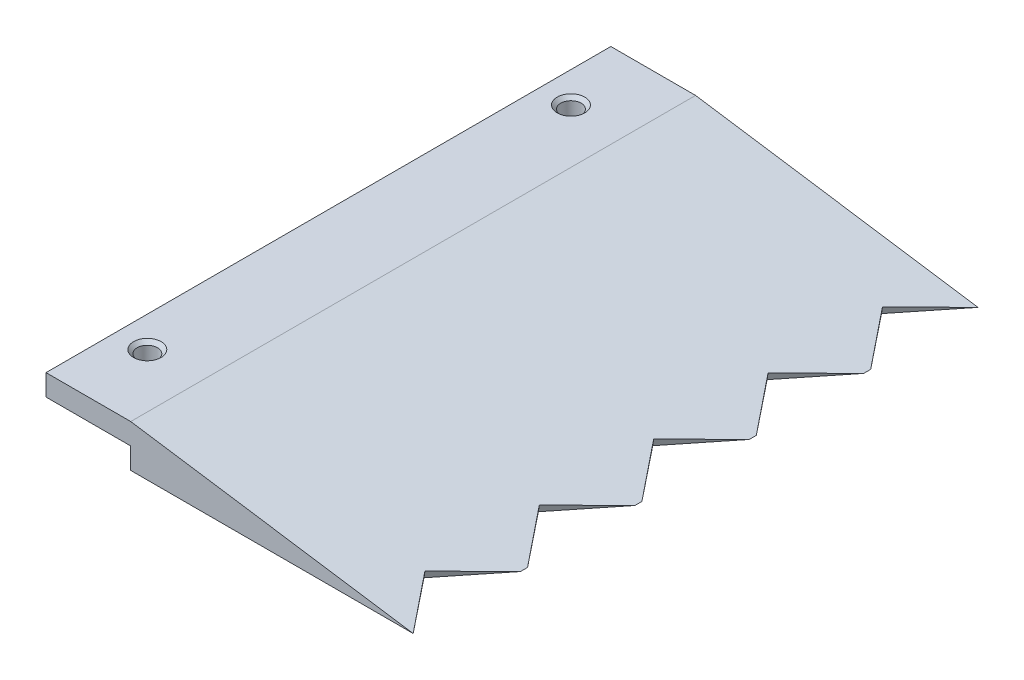
ISO-10303-21;
HEADER;
FILE_DESCRIPTION(('STEP AP214'),'2;1');
FILE_NAME('part.step','',(''),(''),'','','');
FILE_SCHEMA(('AUTOMOTIVE_DESIGN { 1 0 10303 214 1 1 1 1 }'));
ENDSEC;
DATA;
#1=APPLICATION_CONTEXT('core data for automotive mechanical design processes');
#2=APPLICATION_PROTOCOL_DEFINITION('international standard','automotive_design',2000,#1);
#3=PRODUCT_CONTEXT('',#1,'mechanical');
#4=PRODUCT('Part','Part','',(#3));
#5=PRODUCT_RELATED_PRODUCT_CATEGORY('part','',(#4));
#6=PRODUCT_DEFINITION_FORMATION('','',#4);
#7=PRODUCT_DEFINITION_CONTEXT('part definition',#1,'design');
#8=PRODUCT_DEFINITION('design','',#6,#7);
#9=PRODUCT_DEFINITION_SHAPE('','',#8);
#10=(LENGTH_UNIT() NAMED_UNIT(*) SI_UNIT(.MILLI.,.METRE.));
#11=(NAMED_UNIT(*) PLANE_ANGLE_UNIT() SI_UNIT($,.RADIAN.));
#12=(NAMED_UNIT(*) SI_UNIT($,.STERADIAN.) SOLID_ANGLE_UNIT());
#13=UNCERTAINTY_MEASURE_WITH_UNIT(LENGTH_MEASURE(1.E-05),#10,'distance_accuracy_value','');
#14=(GEOMETRIC_REPRESENTATION_CONTEXT(3) GLOBAL_UNCERTAINTY_ASSIGNED_CONTEXT((#13)) GLOBAL_UNIT_ASSIGNED_CONTEXT((#10,
#11,#12)) REPRESENTATION_CONTEXT('',''));
#15=CARTESIAN_POINT('',(0.,0.,0.));
#16=DIRECTION('',(0.,0.,1.));
#17=DIRECTION('',(1.,0.,0.));
#18=AXIS2_PLACEMENT_3D('',#15,#16,#17);
#19=CARTESIAN_POINT('',(0.,3.,40.));
#20=DIRECTION('',(1.,0.,0.));
#21=DIRECTION('',(0.,0.,-1.));
#22=AXIS2_PLACEMENT_3D('',#19,#20,#21);
#23=PLANE('',#22);
#24=DIRECTION('',(0.,-1.,0.));
#25=VECTOR('',#24,1.);
#26=CARTESIAN_POINT('',(0.,3.,-40.));
#27=LINE('',#26,#25);
#28=CARTESIAN_POINT('',(0.,6.,-40.));
#29=VERTEX_POINT('',#28);
#30=CARTESIAN_POINT('',(0.,3.,-40.));
#31=VERTEX_POINT('',#30);
#32=EDGE_CURVE('E225',#29,#31,#27,.T.);
#33=ORIENTED_EDGE('',*,*,#32,.T.);
#34=DIRECTION('',(0.,0.,-1.));
#35=VECTOR('',#34,1.);
#36=CARTESIAN_POINT('',(0.,3.,40.));
#37=LINE('',#36,#35);
#38=CARTESIAN_POINT('',(0.,3.,40.));
#39=VERTEX_POINT('',#38);
#40=EDGE_CURVE('E380',#39,#31,#37,.T.);
#41=ORIENTED_EDGE('',*,*,#40,.F.);
#42=DIRECTION('',(0.,-1.,0.));
#43=VECTOR('',#42,1.);
#44=CARTESIAN_POINT('',(0.,3.,40.));
#45=LINE('',#44,#43);
#46=CARTESIAN_POINT('',(0.,6.,40.));
#47=VERTEX_POINT('',#46);
#48=EDGE_CURVE('E211',#47,#39,#45,.T.);
#49=ORIENTED_EDGE('',*,*,#48,.F.);
#50=DIRECTION('',(0.,0.,-1.));
#51=VECTOR('',#50,1.);
#52=CARTESIAN_POINT('',(0.,6.,40.));
#53=LINE('',#52,#51);
#54=EDGE_CURVE('E198',#47,#29,#53,.T.);
#55=ORIENTED_EDGE('',*,*,#54,.T.);
#56=EDGE_LOOP('',(#33,#41,#49,#55));
#57=FACE_BOUND('',#56,.T.);
#58=ADVANCED_FACE('F39',(#57),#23,.F.);
#59=CARTESIAN_POINT('',(12.,3.,40.));
#60=DIRECTION('',(0.,1.,0.));
#61=DIRECTION('',(-1.,0.,0.));
#62=AXIS2_PLACEMENT_3D('',#59,#60,#61);
#63=PLANE('',#62);
#64=CARTESIAN_POINT('',(4.35,3.,30.));
#65=DIRECTION('',(0.,1.,0.));
#66=DIRECTION('',(-1.,0.,0.));
#67=AXIS2_PLACEMENT_3D('',#64,#65,#66);
#68=CIRCLE('',#67,1.45);
#69=CARTESIAN_POINT('',(2.9,3.,30.));
#70=VERTEX_POINT('',#69);
#71=EDGE_CURVE('E290',#70,#70,#68,.T.);
#72=ORIENTED_EDGE('',*,*,#71,.T.);
#73=EDGE_LOOP('',(#72));
#74=FACE_BOUND('',#73,.T.);
#75=CARTESIAN_POINT('',(4.34999999999979,3.,-30.));
#76=DIRECTION('',(0.,1.,0.));
#77=DIRECTION('',(-1.,0.,0.));
#78=AXIS2_PLACEMENT_3D('',#75,#76,#77);
#79=CIRCLE('',#78,1.45);
#80=CARTESIAN_POINT('',(2.89999999999979,3.,-30.));
#81=VERTEX_POINT('',#80);
#82=EDGE_CURVE('E297',#81,#81,#79,.T.);
#83=ORIENTED_EDGE('',*,*,#82,.T.);
#84=EDGE_LOOP('',(#83));
#85=FACE_BOUND('',#84,.T.);
#86=DIRECTION('',(1.,0.,0.));
#87=VECTOR('',#86,1.);
#88=CARTESIAN_POINT('',(12.,3.,-40.));
#89=LINE('',#88,#87);
#90=CARTESIAN_POINT('',(12.,3.,-40.));
#91=VERTEX_POINT('',#90);
#92=EDGE_CURVE('E222',#31,#91,#89,.T.);
#93=ORIENTED_EDGE('',*,*,#92,.T.);
#94=DIRECTION('',(0.,0.,-1.));
#95=VECTOR('',#94,1.);
#96=CARTESIAN_POINT('',(12.,3.,40.));
#97=LINE('',#96,#95);
#98=CARTESIAN_POINT('',(12.,3.,40.));
#99=VERTEX_POINT('',#98);
#100=EDGE_CURVE('E185',#99,#91,#97,.T.);
#101=ORIENTED_EDGE('',*,*,#100,.F.);
#102=DIRECTION('',(1.,0.,0.));
#103=VECTOR('',#102,1.);
#104=CARTESIAN_POINT('',(12.,3.,40.));
#105=LINE('',#104,#103);
#106=EDGE_CURVE('E242',#39,#99,#105,.T.);
#107=ORIENTED_EDGE('',*,*,#106,.F.);
#108=ORIENTED_EDGE('',*,*,#40,.T.);
#109=EDGE_LOOP('',(#93,#101,#107,#108));
#110=FACE_BOUND('',#109,.T.);
#111=ADVANCED_FACE('F302',(#74,#85,#110),#63,.F.);
#112=CARTESIAN_POINT('',(12.,0.,40.));
#113=DIRECTION('',(1.,0.,0.));
#114=DIRECTION('',(0.,1.,0.));
#115=AXIS2_PLACEMENT_3D('',#112,#113,#114);
#116=PLANE('',#115);
#117=DIRECTION('',(0.,-1.,0.));
#118=VECTOR('',#117,1.);
#119=CARTESIAN_POINT('',(12.,0.,-40.));
#120=LINE('',#119,#118);
#121=CARTESIAN_POINT('',(12.,0.,-40.));
#122=VERTEX_POINT('',#121);
#123=EDGE_CURVE('E219',#91,#122,#120,.T.);
#124=ORIENTED_EDGE('',*,*,#123,.T.);
#125=DIRECTION('',(0.,0.,-1.));
#126=VECTOR('',#125,1.);
#127=CARTESIAN_POINT('',(12.,0.,40.));
#128=LINE('',#127,#126);
#129=CARTESIAN_POINT('',(12.,0.,40.));
#130=VERTEX_POINT('',#129);
#131=EDGE_CURVE('E178',#130,#122,#128,.T.);
#132=ORIENTED_EDGE('',*,*,#131,.F.);
#133=DIRECTION('',(0.,-1.,0.));
#134=VECTOR('',#133,1.);
#135=CARTESIAN_POINT('',(12.,0.,40.));
#136=LINE('',#135,#134);
#137=EDGE_CURVE('E239',#99,#130,#136,.T.);
#138=ORIENTED_EDGE('',*,*,#137,.F.);
#139=ORIENTED_EDGE('',*,*,#100,.T.);
#140=EDGE_LOOP('',(#124,#132,#138,#139));
#141=FACE_BOUND('',#140,.T.);
#142=ADVANCED_FACE('F327',(#141),#116,.F.);
#143=CARTESIAN_POINT('',(52.,0.,40.));
#144=DIRECTION('',(0.,1.,0.));
#145=DIRECTION('',(0.,0.,1.));
#146=AXIS2_PLACEMENT_3D('',#143,#144,#145);
#147=PLANE('',#146);
#148=DIRECTION('',(-0.623887399248366,0.,0.781514243670011));
#149=VECTOR('',#148,1.);
#150=CARTESIAN_POINT('',(28.7913400855593,0.,21.4723908216136));
#151=LINE('',#150,#149);
#152=CARTESIAN_POINT('',(52.,0.,-7.6));
#153=VERTEX_POINT('',#152);
#154=CARTESIAN_POINT('',(45.9328754751529,0.,0.));
#155=VERTEX_POINT('',#154);
#156=EDGE_CURVE('E63',#153,#155,#151,.T.);
#157=ORIENTED_EDGE('',*,*,#156,.T.);
#158=DIRECTION('',(0.623887399248366,0.,0.781514243670011));
#159=VECTOR('',#158,1.);
#160=CARTESIAN_POINT('',(67.7974912022663,0.,27.3887702231152));
#161=LINE('',#160,#159);
#162=CARTESIAN_POINT('',(51.9999999999999,0.,7.6));
#163=VERTEX_POINT('',#162);
#164=EDGE_CURVE('E229',#155,#163,#161,.T.);
#165=ORIENTED_EDGE('',*,*,#164,.T.);
#166=DIRECTION('',(0.,0.,-1.));
#167=VECTOR('',#166,1.);
#168=CARTESIAN_POINT('',(52.,0.,40.));
#169=LINE('',#168,#167);
#170=CARTESIAN_POINT('',(52.,0.,8.6));
#171=VERTEX_POINT('',#170);
#172=EDGE_CURVE('E179',#171,#163,#169,.T.);
#173=ORIENTED_EDGE('',*,*,#172,.F.);
#174=DIRECTION('',(-0.623887399248366,0.,0.781514243670011));
#175=VECTOR('',#174,1.);
#176=CARTESIAN_POINT('',(36.6900856866925,0.,27.778005710056));
#177=LINE('',#176,#175);
#178=CARTESIAN_POINT('',(45.9328754751529,0.,16.2));
#179=VERTEX_POINT('',#178);
#180=EDGE_CURVE('E169',#171,#179,#177,.T.);
#181=ORIENTED_EDGE('',*,*,#180,.T.);
#182=DIRECTION('',(0.623887399248366,0.,0.781514243670011));
#183=VECTOR('',#182,1.);
#184=CARTESIAN_POINT('',(59.8987456011331,0.,33.6943851115576));
#185=LINE('',#184,#183);
#186=CARTESIAN_POINT('',(52.,0.,23.8));
#187=VERTEX_POINT('',#186);
#188=EDGE_CURVE('E152',#179,#187,#185,.T.);
#189=ORIENTED_EDGE('',*,*,#188,.T.);
#190=CARTESIAN_POINT('',(52.,0.,24.8));
#191=VERTEX_POINT('',#190);
#192=EDGE_CURVE('E167',#191,#187,#169,.T.);
#193=ORIENTED_EDGE('',*,*,#192,.F.);
#194=DIRECTION('',(-0.623887399248366,0.,0.781514243670011));
#195=VECTOR('',#194,1.);
#196=CARTESIAN_POINT('',(44.5888312878257,0.,34.0836205984985));
#197=LINE('',#196,#195);
#198=CARTESIAN_POINT('',(45.932875475153,0.,32.4));
#199=VERTEX_POINT('',#198);
#200=EDGE_CURVE('E171',#191,#199,#197,.T.);
#201=ORIENTED_EDGE('',*,*,#200,.T.);
#202=DIRECTION('',(0.623887399248366,0.,0.781514243670012));
#203=VECTOR('',#202,1.);
#204=CARTESIAN_POINT('',(52.,0.,40.));
#205=LINE('',#204,#203);
#206=CARTESIAN_POINT('',(52.,0.,40.));
#207=VERTEX_POINT('',#206);
#208=EDGE_CURVE('E267',#199,#207,#205,.T.);
#209=ORIENTED_EDGE('',*,*,#208,.T.);
#210=DIRECTION('',(1.,0.,0.));
#211=VECTOR('',#210,1.);
#212=CARTESIAN_POINT('',(52.,0.,40.));
#213=LINE('',#212,#211);
#214=EDGE_CURVE('E235',#130,#207,#213,.T.);
#215=ORIENTED_EDGE('',*,*,#214,.F.);
#216=ORIENTED_EDGE('',*,*,#131,.T.);
#217=DIRECTION('',(1.,0.,0.));
#218=VECTOR('',#217,1.);
#219=CARTESIAN_POINT('',(52.,0.,-40.));
#220=LINE('',#219,#218);
#221=CARTESIAN_POINT('',(52.,0.,-40.));
#222=VERTEX_POINT('',#221);
#223=EDGE_CURVE('E215',#122,#222,#220,.T.);
#224=ORIENTED_EDGE('',*,*,#223,.T.);
#225=DIRECTION('',(-0.623887399248366,0.,0.781514243670011));
#226=VECTOR('',#225,1.);
#227=CARTESIAN_POINT('',(12.9938488832929,0.,8.86116104472865));
#228=LINE('',#227,#226);
#229=CARTESIAN_POINT('',(45.9328754751528,0.,-32.4));
#230=VERTEX_POINT('',#229);
#231=EDGE_CURVE('E263',#222,#230,#228,.T.);
#232=ORIENTED_EDGE('',*,*,#231,.T.);
#233=DIRECTION('',(0.623887399248366,0.,0.781514243670011));
#234=VECTOR('',#233,1.);
#235=CARTESIAN_POINT('',(83.5949824045325,0.,14.7775404462304));
#236=LINE('',#235,#234);
#237=CARTESIAN_POINT('',(51.9999999999998,0.,-24.8));
#238=VERTEX_POINT('',#237);
#239=EDGE_CURVE('E259',#230,#238,#236,.T.);
#240=ORIENTED_EDGE('',*,*,#239,.T.);
#241=CARTESIAN_POINT('',(52.,0.,-23.8));
#242=VERTEX_POINT('',#241);
#243=EDGE_CURVE('E181',#242,#238,#169,.T.);
#244=ORIENTED_EDGE('',*,*,#243,.F.);
#245=DIRECTION('',(-0.623887399248366,0.,0.781514243670011));
#246=VECTOR('',#245,1.);
#247=CARTESIAN_POINT('',(20.8925944844261,0.,15.1667759331711));
#248=LINE('',#247,#246);
#249=CARTESIAN_POINT('',(45.9328754751528,0.,-16.2));
#250=VERTEX_POINT('',#249);
#251=EDGE_CURVE('E55',#242,#250,#248,.T.);
#252=ORIENTED_EDGE('',*,*,#251,.T.);
#253=DIRECTION('',(0.623887399248366,0.,0.781514243670011));
#254=VECTOR('',#253,1.);
#255=CARTESIAN_POINT('',(75.6962368033994,0.,21.0831553346728));
#256=LINE('',#255,#254);
#257=CARTESIAN_POINT('',(51.9999999999998,0.,-8.6));
#258=VERTEX_POINT('',#257);
#259=EDGE_CURVE('E253',#250,#258,#256,.T.);
#260=ORIENTED_EDGE('',*,*,#259,.T.);
#261=EDGE_CURVE('E187',#153,#258,#169,.T.);
#262=ORIENTED_EDGE('',*,*,#261,.F.);
#263=EDGE_LOOP('',(#157,#165,#173,#181,#189,#193,#201,#209,#215,#216,#224,#232,#240,#244,#252,
#260,#262));
#264=FACE_BOUND('',#263,.T.);
#265=ADVANCED_FACE('F165',(#264),#147,.F.);
#266=CARTESIAN_POINT('',(12.,6.,40.));
#267=DIRECTION('',(-0.148340452930245,-0.988936352868298,0.));
#268=DIRECTION('',(0.988936352868298,-0.148340452930245,0.));
#269=AXIS2_PLACEMENT_3D('',#266,#267,#268);
#270=PLANE('',#269);
#271=ORIENTED_EDGE('',*,*,#172,.T.);
#272=DIRECTION('',(-0.612788762823007,0.0919183144234511,-0.784882765533426));
#273=VECTOR('',#272,1.);
#274=CARTESIAN_POINT('',(52.2249800040714,-0.0337470006107066,7.88816280339714));
#275=LINE('',#274,#273);
#276=CARTESIAN_POINT('',(46.0663818827901,0.890042717581486,0.));
#277=VERTEX_POINT('',#276);
#278=EDGE_CURVE('E350',#163,#277,#275,.T.);
#279=ORIENTED_EDGE('',*,*,#278,.T.);
#280=DIRECTION('',(0.612788762823008,-0.0919183144234512,-0.784882765533426));
#281=VECTOR('',#280,1.);
#282=CARTESIAN_POINT('',(13.747592895885,5.73786106561724,41.3951136471148));
#283=LINE('',#282,#281);
#284=EDGE_CURVE('E356',#277,#153,#283,.T.);
#285=ORIENTED_EDGE('',*,*,#284,.T.);
#286=ORIENTED_EDGE('',*,*,#261,.T.);
#287=DIRECTION('',(-0.612788762823007,0.0919183144234511,-0.784882765533426));
#288=VECTOR('',#287,1.);
#289=CARTESIAN_POINT('',(60.0166508934791,-1.20249763402186,1.66802628462585));
#290=LINE('',#289,#288);
#291=CARTESIAN_POINT('',(46.0663818827901,0.890042717581486,-16.2));
#292=VERTEX_POINT('',#291);
#293=EDGE_CURVE('E359',#258,#292,#290,.T.);
#294=ORIENTED_EDGE('',*,*,#293,.T.);
#295=DIRECTION('',(0.612788762823008,-0.0919183144234512,-0.784882765533426));
#296=VECTOR('',#295,1.);
#297=CARTESIAN_POINT('',(5.95592200647727,6.90661169902841,35.1749771283434));
#298=LINE('',#297,#296);
#299=EDGE_CURVE('E363',#292,#242,#298,.T.);
#300=ORIENTED_EDGE('',*,*,#299,.T.);
#301=ORIENTED_EDGE('',*,*,#243,.T.);
#302=DIRECTION('',(-0.612788762823007,0.0919183144234511,-0.784882765533426));
#303=VECTOR('',#302,1.);
#304=CARTESIAN_POINT('',(67.8083217828868,-2.37124826743302,-4.55211023414546));
#305=LINE('',#304,#303);
#306=CARTESIAN_POINT('',(46.06638188279,0.890042717581497,-32.4));
#307=VERTEX_POINT('',#306);
#308=EDGE_CURVE('E366',#238,#307,#305,.T.);
#309=ORIENTED_EDGE('',*,*,#308,.T.);
#310=DIRECTION('',(0.612788762823008,-0.0919183144234512,-0.784882765533426));
#311=VECTOR('',#310,1.);
#312=CARTESIAN_POINT('',(-1.8357488829305,8.07536233243957,28.9548406095721));
#313=LINE('',#312,#311);
#314=EDGE_CURVE('E369',#307,#222,#313,.T.);
#315=ORIENTED_EDGE('',*,*,#314,.T.);
#316=DIRECTION('',(-0.988936352868298,0.148340452930245,0.));
#317=VECTOR('',#316,1.);
#318=CARTESIAN_POINT('',(12.,6.,-40.));
#319=LINE('',#318,#317);
#320=CARTESIAN_POINT('',(12.,6.,-40.));
#321=VERTEX_POINT('',#320);
#322=EDGE_CURVE('E212',#222,#321,#319,.T.);
#323=ORIENTED_EDGE('',*,*,#322,.T.);
#324=DIRECTION('',(0.,0.,-1.));
#325=VECTOR('',#324,1.);
#326=CARTESIAN_POINT('',(12.,6.,40.));
#327=LINE('',#326,#325);
#328=CARTESIAN_POINT('',(12.,6.,40.));
#329=VERTEX_POINT('',#328);
#330=EDGE_CURVE('E191',#329,#321,#327,.T.);
#331=ORIENTED_EDGE('',*,*,#330,.F.);
#332=DIRECTION('',(-0.988936352868298,0.148340452930245,0.));
#333=VECTOR('',#332,1.);
#334=CARTESIAN_POINT('',(12.,6.,40.));
#335=LINE('',#334,#333);
#336=EDGE_CURVE('E232',#207,#329,#335,.T.);
#337=ORIENTED_EDGE('',*,*,#336,.F.);
#338=DIRECTION('',(-0.612788762823007,0.0919183144234511,-0.784882765533427));
#339=VECTOR('',#338,1.);
#340=CARTESIAN_POINT('',(36.641638225256,2.3037542662116,20.3284358409397));
#341=LINE('',#340,#339);
#342=CARTESIAN_POINT('',(46.0663818827902,0.890042717581456,32.4));
#343=VERTEX_POINT('',#342);
#344=EDGE_CURVE('E373',#207,#343,#341,.T.);
#345=ORIENTED_EDGE('',*,*,#344,.T.);
#346=DIRECTION('',(0.612788762823008,-0.0919183144234511,-0.784882765533427));
#347=VECTOR('',#346,1.);
#348=CARTESIAN_POINT('',(29.3309346747006,3.40035979879491,53.8353866846575));
#349=LINE('',#348,#347);
#350=EDGE_CURVE('E159',#343,#191,#349,.T.);
#351=ORIENTED_EDGE('',*,*,#350,.T.);
#352=ORIENTED_EDGE('',*,*,#192,.T.);
#353=DIRECTION('',(-0.612788762823007,0.0919183144234511,-0.784882765533426));
#354=VECTOR('',#353,1.);
#355=CARTESIAN_POINT('',(44.4333091146637,1.13500363280045,14.1082993221684));
#356=LINE('',#355,#354);
#357=CARTESIAN_POINT('',(46.0663818827902,0.890042717581471,16.2));
#358=VERTEX_POINT('',#357);
#359=EDGE_CURVE('E149',#187,#358,#356,.T.);
#360=ORIENTED_EDGE('',*,*,#359,.T.);
#361=DIRECTION('',(0.612788762823008,-0.0919183144234512,-0.784882765533426));
#362=VECTOR('',#361,1.);
#363=CARTESIAN_POINT('',(21.5392637852928,4.56911043220608,47.6152501658862));
#364=LINE('',#363,#362);
#365=EDGE_CURVE('E160',#358,#171,#364,.T.);
#366=ORIENTED_EDGE('',*,*,#365,.T.);
#367=EDGE_LOOP('',(#271,#279,#285,#286,#294,#300,#301,#309,#315,#323,#331,#337,#345,#351,#352,
#360,#366));
#368=FACE_BOUND('',#367,.T.);
#369=ADVANCED_FACE('F175',(#368),#270,.F.);
#370=CARTESIAN_POINT('',(0.,6.,40.));
#371=DIRECTION('',(0.,-1.,0.));
#372=DIRECTION('',(0.,0.,-1.));
#373=AXIS2_PLACEMENT_3D('',#370,#371,#372);
#374=PLANE('',#373);
#375=CARTESIAN_POINT('',(4.35,6.,30.));
#376=DIRECTION('',(0.,-1.,0.));
#377=DIRECTION('',(0.,0.,-1.));
#378=AXIS2_PLACEMENT_3D('',#375,#376,#377);
#379=CIRCLE('',#378,1.94999999999999);
#380=CARTESIAN_POINT('',(4.35,6.,28.05));
#381=VERTEX_POINT('',#380);
#382=EDGE_CURVE('E342',#381,#381,#379,.T.);
#383=ORIENTED_EDGE('',*,*,#382,.T.);
#384=EDGE_LOOP('',(#383));
#385=FACE_BOUND('',#384,.T.);
#386=CARTESIAN_POINT('',(4.34999999999979,6.,-30.));
#387=DIRECTION('',(0.,-1.,0.));
#388=DIRECTION('',(0.,0.,-1.));
#389=AXIS2_PLACEMENT_3D('',#386,#387,#388);
#390=CIRCLE('',#389,1.95000000000001);
#391=CARTESIAN_POINT('',(4.34999999999979,6.,-31.95));
#392=VERTEX_POINT('',#391);
#393=EDGE_CURVE('E345',#392,#392,#390,.T.);
#394=ORIENTED_EDGE('',*,*,#393,.T.);
#395=EDGE_LOOP('',(#394));
#396=FACE_BOUND('',#395,.T.);
#397=DIRECTION('',(-1.,0.,0.));
#398=VECTOR('',#397,1.);
#399=CARTESIAN_POINT('',(0.,6.,-40.));
#400=LINE('',#399,#398);
#401=EDGE_CURVE('E208',#321,#29,#400,.T.);
#402=ORIENTED_EDGE('',*,*,#401,.T.);
#403=ORIENTED_EDGE('',*,*,#54,.F.);
#404=DIRECTION('',(-1.,0.,0.));
#405=VECTOR('',#404,1.);
#406=CARTESIAN_POINT('',(0.,6.,40.));
#407=LINE('',#406,#405);
#408=EDGE_CURVE('E205',#329,#47,#407,.T.);
#409=ORIENTED_EDGE('',*,*,#408,.F.);
#410=ORIENTED_EDGE('',*,*,#330,.T.);
#411=EDGE_LOOP('',(#402,#403,#409,#410));
#412=FACE_BOUND('',#411,.T.);
#413=ADVANCED_FACE('F401',(#385,#396,#412),#374,.F.);
#414=CARTESIAN_POINT('',(0.,0.,40.));
#415=DIRECTION('',(0.,0.,-1.));
#416=DIRECTION('',(-1.,0.,0.));
#417=AXIS2_PLACEMENT_3D('',#414,#415,#416);
#418=PLANE('',#417);
#419=ORIENTED_EDGE('',*,*,#48,.T.);
#420=ORIENTED_EDGE('',*,*,#106,.T.);
#421=ORIENTED_EDGE('',*,*,#137,.T.);
#422=ORIENTED_EDGE('',*,*,#214,.T.);
#423=ORIENTED_EDGE('',*,*,#336,.T.);
#424=ORIENTED_EDGE('',*,*,#408,.T.);
#425=EDGE_LOOP('',(#419,#420,#421,#422,#423,#424));
#426=FACE_BOUND('',#425,.T.);
#427=ADVANCED_FACE('F399',(#426),#418,.F.);
#428=CARTESIAN_POINT('',(0.,0.,-40.));
#429=DIRECTION('',(0.,0.,-1.));
#430=DIRECTION('',(-1.,0.,0.));
#431=AXIS2_PLACEMENT_3D('',#428,#429,#430);
#432=PLANE('',#431);
#433=ORIENTED_EDGE('',*,*,#32,.F.);
#434=ORIENTED_EDGE('',*,*,#401,.F.);
#435=ORIENTED_EDGE('',*,*,#322,.F.);
#436=ORIENTED_EDGE('',*,*,#223,.F.);
#437=ORIENTED_EDGE('',*,*,#123,.F.);
#438=ORIENTED_EDGE('',*,*,#92,.F.);
#439=EDGE_LOOP('',(#433,#434,#435,#436,#437,#438));
#440=FACE_BOUND('',#439,.T.);
#441=ADVANCED_FACE('F394',(#440),#432,.T.);
#442=CARTESIAN_POINT('',(46.0663818827902,-39.5574541147319,23.8));
#443=DIRECTION('',(-0.77619909957581,0.116429864936371,0.619644288579021));
#444=DIRECTION('',(0.623887399248366,0.,0.781514243670011));
#445=AXIS2_PLACEMENT_3D('',#442,#443,#444);
#446=PLANE('',#445);
#447=DIRECTION('',(0.148340452930245,0.988936352868298,0.));
#448=VECTOR('',#447,1.);
#449=CARTESIAN_POINT('',(40.1327637655804,-38.6674113971504,16.2));
#450=LINE('',#449,#448);
#451=EDGE_CURVE('E154',#179,#358,#450,.T.);
#452=ORIENTED_EDGE('',*,*,#451,.T.);
#453=ORIENTED_EDGE('',*,*,#359,.F.);
#454=ORIENTED_EDGE('',*,*,#188,.F.);
#455=EDGE_LOOP('',(#452,#453,#454));
#456=FACE_BOUND('',#455,.T.);
#457=ADVANCED_FACE('F151',(#456),#446,.F.);
#458=CARTESIAN_POINT('',(40.1327637655804,-38.6674113971504,16.2));
#459=DIRECTION('',(-0.776199099575809,0.116429864936371,-0.619644288579021));
#460=DIRECTION('',(-0.623887399248366,0.,0.781514243670011));
#461=AXIS2_PLACEMENT_3D('',#458,#459,#460);
#462=PLANE('',#461);
#463=ORIENTED_EDGE('',*,*,#365,.F.);
#464=ORIENTED_EDGE('',*,*,#451,.F.);
#465=ORIENTED_EDGE('',*,*,#180,.F.);
#466=EDGE_LOOP('',(#463,#464,#465));
#467=FACE_BOUND('',#466,.T.);
#468=ADVANCED_FACE('F452',(#467),#462,.F.);
#469=CARTESIAN_POINT('',(46.0663818827902,-39.5574541147319,40.));
#470=DIRECTION('',(-0.77619909957581,0.116429864936372,0.61964428857902));
#471=DIRECTION('',(0.623887399248366,0.,0.781514243670012));
#472=AXIS2_PLACEMENT_3D('',#469,#470,#471);
#473=PLANE('',#472);
#474=DIRECTION('',(0.148340452930245,0.988936352868298,0.));
#475=VECTOR('',#474,1.);
#476=CARTESIAN_POINT('',(40.1327637655804,-38.6674113971504,32.4));
#477=LINE('',#476,#475);
#478=EDGE_CURVE('E286',#199,#343,#477,.T.);
#479=ORIENTED_EDGE('',*,*,#478,.T.);
#480=ORIENTED_EDGE('',*,*,#344,.F.);
#481=ORIENTED_EDGE('',*,*,#208,.F.);
#482=EDGE_LOOP('',(#479,#480,#481));
#483=FACE_BOUND('',#482,.T.);
#484=ADVANCED_FACE('F461',(#483),#473,.F.);
#485=CARTESIAN_POINT('',(40.1327637655804,-38.6674113971504,32.4));
#486=DIRECTION('',(-0.77619909957581,0.116429864936371,-0.61964428857902));
#487=DIRECTION('',(-0.623887399248366,0.,0.781514243670011));
#488=AXIS2_PLACEMENT_3D('',#485,#486,#487);
#489=PLANE('',#488);
#490=ORIENTED_EDGE('',*,*,#350,.F.);
#491=ORIENTED_EDGE('',*,*,#478,.F.);
#492=ORIENTED_EDGE('',*,*,#200,.F.);
#493=EDGE_LOOP('',(#490,#491,#492));
#494=FACE_BOUND('',#493,.T.);
#495=ADVANCED_FACE('F471',(#494),#489,.F.);
#496=CARTESIAN_POINT('',(46.06638188279,-39.5574541147319,-24.8));
#497=DIRECTION('',(-0.77619909957581,0.116429864936371,0.619644288579021));
#498=DIRECTION('',(0.623887399248366,0.,0.781514243670011));
#499=AXIS2_PLACEMENT_3D('',#496,#497,#498);
#500=PLANE('',#499);
#501=DIRECTION('',(0.148340452930245,0.988936352868298,0.));
#502=VECTOR('',#501,1.);
#503=CARTESIAN_POINT('',(40.1327637655802,-38.6674113971504,-32.4));
#504=LINE('',#503,#502);
#505=EDGE_CURVE('E282',#230,#307,#504,.T.);
#506=ORIENTED_EDGE('',*,*,#505,.T.);
#507=ORIENTED_EDGE('',*,*,#308,.F.);
#508=ORIENTED_EDGE('',*,*,#239,.F.);
#509=EDGE_LOOP('',(#506,#507,#508));
#510=FACE_BOUND('',#509,.T.);
#511=ADVANCED_FACE('F481',(#510),#500,.F.);
#512=CARTESIAN_POINT('',(40.1327637655802,-38.6674113971504,-32.4));
#513=DIRECTION('',(-0.776199099575809,0.116429864936371,-0.619644288579021));
#514=DIRECTION('',(-0.623887399248366,0.,0.781514243670011));
#515=AXIS2_PLACEMENT_3D('',#512,#513,#514);
#516=PLANE('',#515);
#517=ORIENTED_EDGE('',*,*,#314,.F.);
#518=ORIENTED_EDGE('',*,*,#505,.F.);
#519=ORIENTED_EDGE('',*,*,#231,.F.);
#520=EDGE_LOOP('',(#517,#518,#519));
#521=FACE_BOUND('',#520,.T.);
#522=ADVANCED_FACE('F491',(#521),#516,.F.);
#523=CARTESIAN_POINT('',(46.0663818827901,-39.5574541147319,-8.6));
#524=DIRECTION('',(-0.77619909957581,0.116429864936371,0.619644288579021));
#525=DIRECTION('',(0.623887399248366,0.,0.781514243670011));
#526=AXIS2_PLACEMENT_3D('',#523,#524,#525);
#527=PLANE('',#526);
#528=DIRECTION('',(0.148340452930245,0.988936352868298,0.));
#529=VECTOR('',#528,1.);
#530=CARTESIAN_POINT('',(40.1327637655803,-38.6674113971504,-16.2));
#531=LINE('',#530,#529);
#532=EDGE_CURVE('E278',#250,#292,#531,.T.);
#533=ORIENTED_EDGE('',*,*,#532,.T.);
#534=ORIENTED_EDGE('',*,*,#293,.F.);
#535=ORIENTED_EDGE('',*,*,#259,.F.);
#536=EDGE_LOOP('',(#533,#534,#535));
#537=FACE_BOUND('',#536,.T.);
#538=ADVANCED_FACE('F501',(#537),#527,.F.);
#539=CARTESIAN_POINT('',(40.1327637655803,-38.6674113971504,-16.2));
#540=DIRECTION('',(-0.776199099575809,0.116429864936371,-0.619644288579021));
#541=DIRECTION('',(-0.623887399248366,0.,0.781514243670011));
#542=AXIS2_PLACEMENT_3D('',#539,#540,#541);
#543=PLANE('',#542);
#544=ORIENTED_EDGE('',*,*,#299,.F.);
#545=ORIENTED_EDGE('',*,*,#532,.F.);
#546=ORIENTED_EDGE('',*,*,#251,.F.);
#547=EDGE_LOOP('',(#544,#545,#546));
#548=FACE_BOUND('',#547,.T.);
#549=ADVANCED_FACE('F510',(#548),#543,.F.);
#550=CARTESIAN_POINT('',(46.0663818827901,-39.5574541147319,7.6));
#551=DIRECTION('',(-0.77619909957581,0.116429864936371,0.619644288579021));
#552=DIRECTION('',(0.623887399248366,0.,0.781514243670011));
#553=AXIS2_PLACEMENT_3D('',#550,#551,#552);
#554=PLANE('',#553);
#555=DIRECTION('',(0.148340452930245,0.988936352868298,0.));
#556=VECTOR('',#555,1.);
#557=CARTESIAN_POINT('',(40.1327637655803,-38.6674113971504,0.));
#558=LINE('',#557,#556);
#559=EDGE_CURVE('E277',#155,#277,#558,.T.);
#560=ORIENTED_EDGE('',*,*,#559,.T.);
#561=ORIENTED_EDGE('',*,*,#278,.F.);
#562=ORIENTED_EDGE('',*,*,#164,.F.);
#563=EDGE_LOOP('',(#560,#561,#562));
#564=FACE_BOUND('',#563,.T.);
#565=ADVANCED_FACE('F318',(#564),#554,.F.);
#566=CARTESIAN_POINT('',(40.1327637655803,-38.6674113971504,0.));
#567=DIRECTION('',(-0.776199099575809,0.116429864936371,-0.619644288579021));
#568=DIRECTION('',(-0.623887399248366,0.,0.781514243670011));
#569=AXIS2_PLACEMENT_3D('',#566,#567,#568);
#570=PLANE('',#569);
#571=ORIENTED_EDGE('',*,*,#284,.F.);
#572=ORIENTED_EDGE('',*,*,#559,.F.);
#573=ORIENTED_EDGE('',*,*,#156,.F.);
#574=EDGE_LOOP('',(#571,#572,#573));
#575=FACE_BOUND('',#574,.T.);
#576=ADVANCED_FACE('F308',(#575),#570,.F.);
#577=CARTESIAN_POINT('',(4.34999999999979,-34.,-30.));
#578=DIRECTION('',(0.,1.,0.));
#579=DIRECTION('',(0.,0.,1.));
#580=AXIS2_PLACEMENT_3D('',#577,#578,#579);
#581=CYLINDRICAL_SURFACE('',#580,1.45);
#582=CARTESIAN_POINT('',(4.34999999999979,5.49999999999999,-30.));
#583=DIRECTION('',(0.,-1.,0.));
#584=DIRECTION('',(0.,0.,-1.));
#585=AXIS2_PLACEMENT_3D('',#582,#583,#584);
#586=CIRCLE('',#585,1.45);
#587=CARTESIAN_POINT('',(4.34999999999979,5.49999999999999,-31.45));
#588=VERTEX_POINT('',#587);
#589=EDGE_CURVE('E11',#588,#588,#586,.F.);
#590=ORIENTED_EDGE('',*,*,#589,.T.);
#591=EDGE_LOOP('',(#590));
#592=FACE_BOUND('',#591,.T.);
#593=ORIENTED_EDGE('',*,*,#82,.F.);
#594=EDGE_LOOP('',(#593));
#595=FACE_BOUND('',#594,.T.);
#596=ADVANCED_FACE('F305',(#592,#595),#581,.F.);
#597=CARTESIAN_POINT('',(4.35,-34.,30.));
#598=DIRECTION('',(0.,1.,0.));
#599=DIRECTION('',(0.,0.,1.));
#600=AXIS2_PLACEMENT_3D('',#597,#598,#599);
#601=CYLINDRICAL_SURFACE('',#600,1.45);
#602=CARTESIAN_POINT('',(4.35,5.50000000000001,30.));
#603=DIRECTION('',(0.,-1.,0.));
#604=DIRECTION('',(0.,0.,-1.));
#605=AXIS2_PLACEMENT_3D('',#602,#603,#604);
#606=CIRCLE('',#605,1.45);
#607=CARTESIAN_POINT('',(4.35,5.50000000000001,28.55));
#608=VERTEX_POINT('',#607);
#609=EDGE_CURVE('E48',#608,#608,#606,.F.);
#610=ORIENTED_EDGE('',*,*,#609,.T.);
#611=EDGE_LOOP('',(#610));
#612=FACE_BOUND('',#611,.T.);
#613=ORIENTED_EDGE('',*,*,#71,.F.);
#614=EDGE_LOOP('',(#613));
#615=FACE_BOUND('',#614,.T.);
#616=ADVANCED_FACE('F307',(#612,#615),#601,.F.);
#617=CARTESIAN_POINT('',(4.35,6.,30.));
#618=DIRECTION('',(0.,1.,0.));
#619=DIRECTION('',(0.,0.,1.));
#620=AXIS2_PLACEMENT_3D('',#617,#618,#619);
#621=CONICAL_SURFACE('',#620,1.94999999999999,0.785398163397455);
#622=ORIENTED_EDGE('',*,*,#609,.F.);
#623=EDGE_LOOP('',(#622));
#624=FACE_BOUND('',#623,.T.);
#625=ORIENTED_EDGE('',*,*,#382,.F.);
#626=EDGE_LOOP('',(#625));
#627=FACE_BOUND('',#626,.T.);
#628=ADVANCED_FACE('F315',(#624,#627),#621,.F.);
#629=CARTESIAN_POINT('',(4.34999999999979,6.,-30.));
#630=DIRECTION('',(0.,1.,0.));
#631=DIRECTION('',(0.,0.,1.));
#632=AXIS2_PLACEMENT_3D('',#629,#630,#631);
#633=CONICAL_SURFACE('',#632,1.95000000000001,0.785398163397448);
#634=ORIENTED_EDGE('',*,*,#589,.F.);
#635=EDGE_LOOP('',(#634));
#636=FACE_BOUND('',#635,.T.);
#637=ORIENTED_EDGE('',*,*,#393,.F.);
#638=EDGE_LOOP('',(#637));
#639=FACE_BOUND('',#638,.T.);
#640=ADVANCED_FACE('F41',(#636,#639),#633,.F.);
#641=CLOSED_SHELL('',(#58,#111,#142,#265,#369,#413,#427,#441,#457,#468,#484,#495,#511,#522,#538,
#549,#565,#576,#596,#616,#628,#640));
#642=MANIFOLD_SOLID_BREP('B2',#641);
#643=ADVANCED_BREP_SHAPE_REPRESENTATION('',(#18,#642),#14);
#644=SHAPE_DEFINITION_REPRESENTATION(#9,#643);
ENDSEC;
END-ISO-10303-21;
